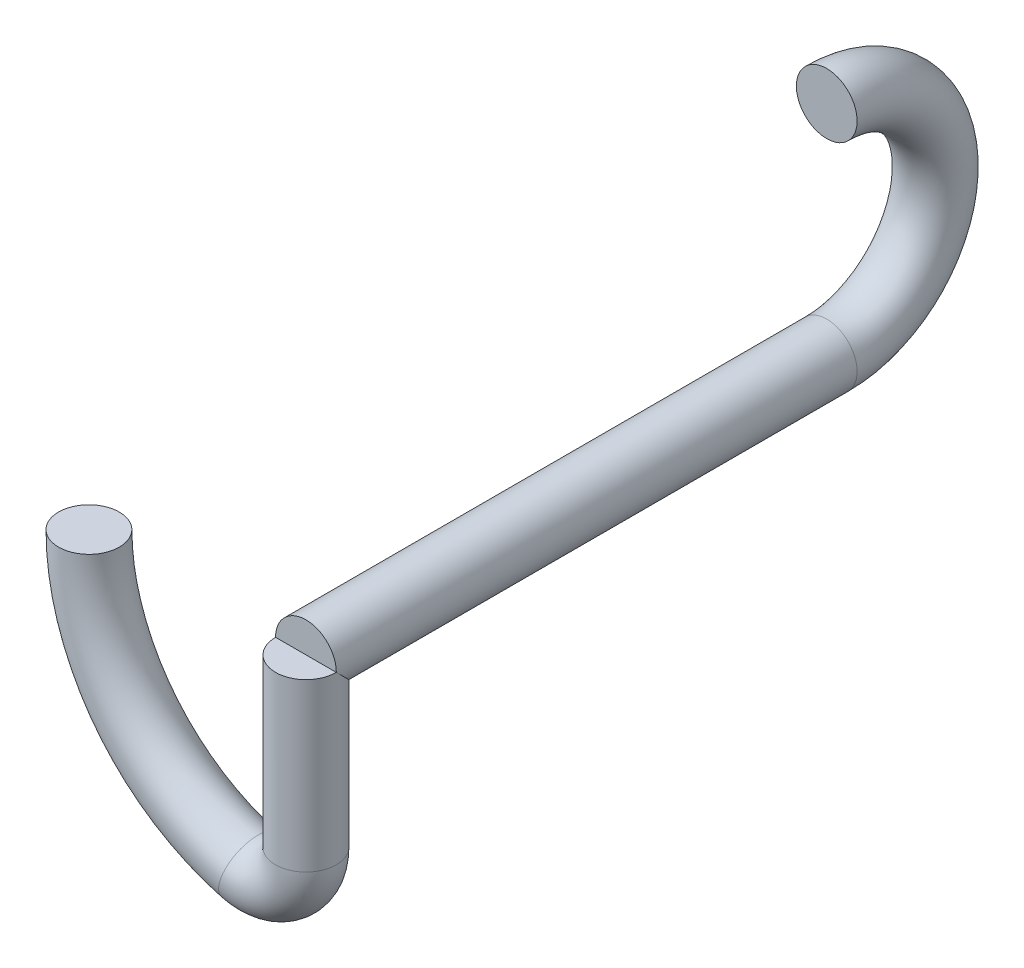
ISO-10303-21;
HEADER;
FILE_DESCRIPTION(('STEP AP214'),'2;1');
FILE_NAME('part.step','',(''),(''),'','','');
FILE_SCHEMA(('AUTOMOTIVE_DESIGN { 1 0 10303 214 1 1 1 1 }'));
ENDSEC;
DATA;
#1=APPLICATION_CONTEXT('core data for automotive mechanical design processes');
#2=APPLICATION_PROTOCOL_DEFINITION('international standard','automotive_design',2000,#1);
#3=PRODUCT_CONTEXT('',#1,'mechanical');
#4=PRODUCT('Part','Part','',(#3));
#5=PRODUCT_RELATED_PRODUCT_CATEGORY('part','',(#4));
#6=PRODUCT_DEFINITION_FORMATION('','',#4);
#7=PRODUCT_DEFINITION_CONTEXT('part definition',#1,'design');
#8=PRODUCT_DEFINITION('design','',#6,#7);
#9=PRODUCT_DEFINITION_SHAPE('','',#8);
#10=(LENGTH_UNIT() NAMED_UNIT(*) SI_UNIT(.MILLI.,.METRE.));
#11=(NAMED_UNIT(*) PLANE_ANGLE_UNIT() SI_UNIT($,.RADIAN.));
#12=(NAMED_UNIT(*) SI_UNIT($,.STERADIAN.) SOLID_ANGLE_UNIT());
#13=UNCERTAINTY_MEASURE_WITH_UNIT(LENGTH_MEASURE(1.E-05),#10,'distance_accuracy_value','');
#14=(GEOMETRIC_REPRESENTATION_CONTEXT(3) GLOBAL_UNCERTAINTY_ASSIGNED_CONTEXT((#13)) GLOBAL_UNIT_ASSIGNED_CONTEXT((#10,
#11,#12)) REPRESENTATION_CONTEXT('',''));
#15=CARTESIAN_POINT('',(0.,0.,0.));
#16=DIRECTION('',(0.,0.,1.));
#17=DIRECTION('',(1.,0.,0.));
#18=AXIS2_PLACEMENT_3D('',#15,#16,#17);
#19=CARTESIAN_POINT('',(0.,0.,0.));
#20=DIRECTION('',(0.,-1.,0.));
#21=DIRECTION('',(0.,0.,-1.));
#22=AXIS2_PLACEMENT_3D('',#19,#20,#21);
#23=CYLINDRICAL_SURFACE('',#22,3.5);
#24=CARTESIAN_POINT('',(0.,-19.2,0.));
#25=DIRECTION('',(0.,1.,0.));
#26=DIRECTION('',(-1.,0.,0.));
#27=AXIS2_PLACEMENT_3D('',#24,#25,#26);
#28=CIRCLE('',#27,3.5);
#29=CARTESIAN_POINT('',(3.5,-19.2,0.));
#30=VERTEX_POINT('',#29);
#31=EDGE_CURVE('E81',#30,#30,#28,.T.);
#32=ORIENTED_EDGE('',*,*,#31,.T.);
#33=EDGE_LOOP('',(#32));
#34=FACE_BOUND('',#33,.T.);
#35=CARTESIAN_POINT('',(0.,0.,0.));
#36=DIRECTION('',(0.,-0.707106781186547,0.707106781186547));
#37=DIRECTION('',(0.,-0.707106781186547,-0.707106781186547));
#38=AXIS2_PLACEMENT_3D('',#35,#36,#37);
#39=ELLIPSE('',#38,4.94974746830583,3.5);
#40=CARTESIAN_POINT('',(3.5,0.,0.));
#41=VERTEX_POINT('',#40);
#42=CARTESIAN_POINT('',(-3.5,0.,0.));
#43=VERTEX_POINT('',#42);
#44=EDGE_CURVE('E12',#41,#43,#39,.F.);
#45=ORIENTED_EDGE('',*,*,#44,.F.);
#46=CARTESIAN_POINT('',(0.,0.,0.));
#47=DIRECTION('',(0.,1.,0.));
#48=DIRECTION('',(-1.,0.,0.));
#49=AXIS2_PLACEMENT_3D('',#46,#47,#48);
#50=CIRCLE('',#49,3.5);
#51=EDGE_CURVE('E77',#43,#41,#50,.T.);
#52=ORIENTED_EDGE('',*,*,#51,.F.);
#53=EDGE_LOOP('',(#45,#52));
#54=FACE_BOUND('',#53,.T.);
#55=ADVANCED_FACE('F63',(#34,#54),#23,.T.);
#56=CARTESIAN_POINT('',(0.,0.,0.));
#57=DIRECTION('',(0.,0.,-1.));
#58=DIRECTION('',(-1.,0.,0.));
#59=AXIS2_PLACEMENT_3D('',#56,#57,#58);
#60=TOROIDAL_SURFACE('',#59,25.,3.5);
#61=CARTESIAN_POINT('',(-6.45002214081559,-24.1536170041464,0.));
#62=DIRECTION('',(0.966144680165855,-0.258000885632624,0.));
#63=DIRECTION('',(0.258000885632624,0.966144680165855,0.));
#64=AXIS2_PLACEMENT_3D('',#61,#62,#63);
#65=CIRCLE('',#64,3.5);
#66=CARTESIAN_POINT('',(-7.35302524052977,-27.5351233847269,0.));
#67=VERTEX_POINT('',#66);
#68=EDGE_CURVE('E102',#67,#67,#65,.T.);
#69=CARTESIAN_POINT('',(-25.,0.,0.));
#70=DIRECTION('',(0.,-1.,0.));
#71=DIRECTION('',(1.,0.,0.));
#72=AXIS2_PLACEMENT_3D('',#69,#70,#71);
#73=CIRCLE('',#72,3.5);
#74=CARTESIAN_POINT('',(-28.5,0.,0.));
#75=VERTEX_POINT('',#74);
#76=EDGE_CURVE('E71',#75,#75,#73,.T.);
#77=CARTESIAN_POINT('',(0.,0.,0.));
#78=DIRECTION('',(0.,0.,-1.));
#79=DIRECTION('',(-1.,0.,0.));
#80=AXIS2_PLACEMENT_3D('',#77,#78,#79);
#81=CIRCLE('',#80,28.5);
#82=EDGE_CURVE('',#67,#75,#81,.T.);
#83=ORIENTED_EDGE('',*,*,#68,.F.);
#84=ORIENTED_EDGE('',*,*,#76,.T.);
#85=ORIENTED_EDGE('',*,*,#82,.T.);
#86=ORIENTED_EDGE('',*,*,#82,.F.);
#87=EDGE_LOOP('',(#83,#85,#84,#86));
#88=FACE_BOUND('',#87,.T.);
#89=ADVANCED_FACE('F107',(#88),#60,.T.);
#90=CARTESIAN_POINT('',(-25.,0.,0.));
#91=DIRECTION('',(0.,-1.,0.));
#92=DIRECTION('',(1.,0.,0.));
#93=AXIS2_PLACEMENT_3D('',#90,#91,#92);
#94=PLANE('',#93);
#95=ORIENTED_EDGE('',*,*,#76,.F.);
#96=EDGE_LOOP('',(#95));
#97=FACE_BOUND('',#96,.T.);
#98=ADVANCED_FACE('F110',(#97),#94,.F.);
#99=CARTESIAN_POINT('',(0.,0.,0.));
#100=DIRECTION('',(0.,1.,0.));
#101=DIRECTION('',(-1.,0.,0.));
#102=AXIS2_PLACEMENT_3D('',#99,#100,#101);
#103=PLANE('',#102);
#104=DIRECTION('',(1.,0.,0.));
#105=VECTOR('',#104,1.);
#106=CARTESIAN_POINT('',(0.,0.,0.));
#107=LINE('',#106,#105);
#108=EDGE_CURVE('E82',#43,#41,#107,.T.);
#109=ORIENTED_EDGE('',*,*,#108,.F.);
#110=ORIENTED_EDGE('',*,*,#51,.T.);
#111=EDGE_LOOP('',(#109,#110));
#112=FACE_BOUND('',#111,.T.);
#113=ADVANCED_FACE('F65',(#112),#103,.T.);
#114=CARTESIAN_POINT('',(-5.1272,-19.2,0.));
#115=DIRECTION('',(0.,0.,-1.));
#116=DIRECTION('',(-1.,0.,0.));
#117=AXIS2_PLACEMENT_3D('',#114,#115,#116);
#118=TOROIDAL_SURFACE('',#117,5.12720000000001,3.5);
#119=CARTESIAN_POINT('',(-5.1272,-19.2,0.));
#120=DIRECTION('',(0.,0.,-1.));
#121=DIRECTION('',(-1.,0.,0.));
#122=AXIS2_PLACEMENT_3D('',#119,#120,#121);
#123=CIRCLE('',#122,8.62720000000001);
#124=EDGE_CURVE('',#30,#67,#123,.T.);
#125=ORIENTED_EDGE('',*,*,#31,.F.);
#126=ORIENTED_EDGE('',*,*,#68,.T.);
#127=ORIENTED_EDGE('',*,*,#124,.T.);
#128=ORIENTED_EDGE('',*,*,#124,.F.);
#129=EDGE_LOOP('',(#125,#127,#126,#128));
#130=FACE_BOUND('',#129,.T.);
#131=ADVANCED_FACE('F112',(#130),#118,.T.);
#132=CARTESIAN_POINT('',(0.,0.,0.));
#133=DIRECTION('',(0.,0.,-1.));
#134=DIRECTION('',(-1.,0.,0.));
#135=AXIS2_PLACEMENT_3D('',#132,#133,#134);
#136=CYLINDRICAL_SURFACE('',#135,3.5);
#137=CARTESIAN_POINT('',(0.,0.,-60.));
#138=DIRECTION('',(0.,0.,1.));
#139=DIRECTION('',(-1.,0.,0.));
#140=AXIS2_PLACEMENT_3D('',#137,#138,#139);
#141=CIRCLE('',#140,3.5);
#142=CARTESIAN_POINT('',(0.,-3.5,-60.));
#143=VERTEX_POINT('',#142);
#144=EDGE_CURVE('E93',#143,#143,#141,.T.);
#145=ORIENTED_EDGE('',*,*,#144,.T.);
#146=EDGE_LOOP('',(#145));
#147=FACE_BOUND('',#146,.T.);
#148=CARTESIAN_POINT('',(0.,0.,0.));
#149=DIRECTION('',(0.,0.,1.));
#150=DIRECTION('',(-1.,0.,0.));
#151=AXIS2_PLACEMENT_3D('',#148,#149,#150);
#152=CIRCLE('',#151,3.5);
#153=EDGE_CURVE('E91',#41,#43,#152,.T.);
#154=ORIENTED_EDGE('',*,*,#153,.F.);
#155=ORIENTED_EDGE('',*,*,#44,.T.);
#156=EDGE_LOOP('',(#154,#155));
#157=FACE_BOUND('',#156,.T.);
#158=ADVANCED_FACE('F90',(#147,#157),#136,.T.);
#159=CARTESIAN_POINT('',(0.,0.,0.));
#160=DIRECTION('',(0.,0.,1.));
#161=DIRECTION('',(-1.,0.,0.));
#162=AXIS2_PLACEMENT_3D('',#159,#160,#161);
#163=PLANE('',#162);
#164=ORIENTED_EDGE('',*,*,#153,.T.);
#165=ORIENTED_EDGE('',*,*,#108,.T.);
#166=EDGE_LOOP('',(#164,#165));
#167=FACE_BOUND('',#166,.T.);
#168=ADVANCED_FACE('F92',(#167),#163,.T.);
#169=CARTESIAN_POINT('',(0.,25.,-60.));
#170=DIRECTION('',(0.,0.,-1.));
#171=DIRECTION('',(-1.,0.,0.));
#172=AXIS2_PLACEMENT_3D('',#169,#170,#171);
#173=PLANE('',#172);
#174=CARTESIAN_POINT('',(0.,25.,-60.));
#175=DIRECTION('',(0.,0.,-1.));
#176=DIRECTION('',(-1.,0.,0.));
#177=AXIS2_PLACEMENT_3D('',#174,#175,#176);
#178=CIRCLE('',#177,3.5);
#179=CARTESIAN_POINT('',(0.,28.5,-60.));
#180=VERTEX_POINT('',#179);
#181=EDGE_CURVE('E87',#180,#180,#178,.T.);
#182=ORIENTED_EDGE('',*,*,#181,.F.);
#183=EDGE_LOOP('',(#182));
#184=FACE_BOUND('',#183,.T.);
#185=ADVANCED_FACE('F129',(#184),#173,.F.);
#186=CARTESIAN_POINT('',(0.,12.5,-60.));
#187=DIRECTION('',(1.,0.,0.));
#188=DIRECTION('',(0.,1.,0.));
#189=AXIS2_PLACEMENT_3D('',#186,#187,#188);
#190=TOROIDAL_SURFACE('',#189,12.5,3.5);
#191=CARTESIAN_POINT('',(0.,12.5,-60.));
#192=DIRECTION('',(1.,0.,0.));
#193=DIRECTION('',(0.,1.,0.));
#194=AXIS2_PLACEMENT_3D('',#191,#192,#193);
#195=CIRCLE('',#194,16.);
#196=EDGE_CURVE('',#143,#180,#195,.T.);
#197=ORIENTED_EDGE('',*,*,#144,.F.);
#198=ORIENTED_EDGE('',*,*,#181,.T.);
#199=ORIENTED_EDGE('',*,*,#196,.T.);
#200=ORIENTED_EDGE('',*,*,#196,.F.);
#201=EDGE_LOOP('',(#197,#199,#198,#200));
#202=FACE_BOUND('',#201,.T.);
#203=ADVANCED_FACE('F132',(#202),#190,.T.);
#204=CLOSED_SHELL('',(#55,#89,#98,#113,#131,#158,#168,#185,#203));
#205=MANIFOLD_SOLID_BREP('B2',#204);
#206=ADVANCED_BREP_SHAPE_REPRESENTATION('',(#18,#205),#14);
#207=SHAPE_DEFINITION_REPRESENTATION(#9,#206);
ENDSEC;
END-ISO-10303-21;
